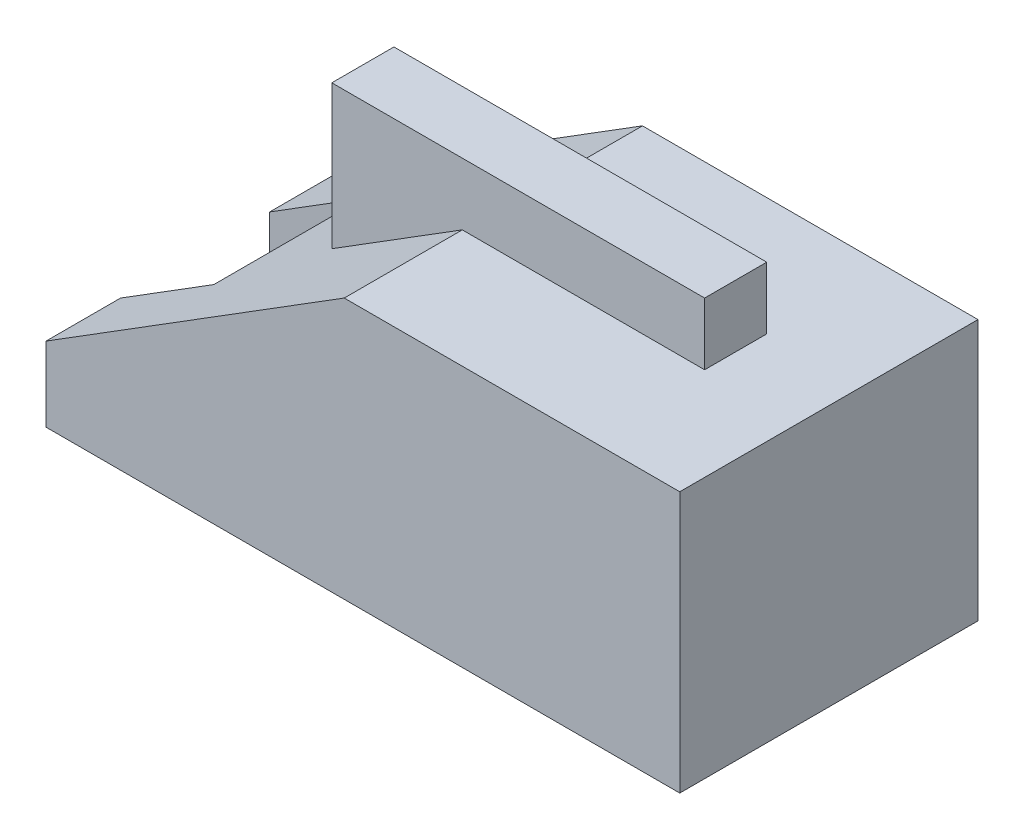
ISO-10303-21;
HEADER;
FILE_DESCRIPTION(('STEP AP214'),'2;1');
FILE_NAME('part.step','',(''),(''),'','','');
FILE_SCHEMA(('AUTOMOTIVE_DESIGN { 1 0 10303 214 1 1 1 1 }'));
ENDSEC;
DATA;
#1=APPLICATION_CONTEXT('core data for automotive mechanical design processes');
#2=APPLICATION_PROTOCOL_DEFINITION('international standard','automotive_design',2000,#1);
#3=PRODUCT_CONTEXT('',#1,'mechanical');
#4=PRODUCT('Part','Part','',(#3));
#5=PRODUCT_RELATED_PRODUCT_CATEGORY('part','',(#4));
#6=PRODUCT_DEFINITION_FORMATION('','',#4);
#7=PRODUCT_DEFINITION_CONTEXT('part definition',#1,'design');
#8=PRODUCT_DEFINITION('design','',#6,#7);
#9=PRODUCT_DEFINITION_SHAPE('','',#8);
#10=(LENGTH_UNIT() NAMED_UNIT(*) SI_UNIT(.MILLI.,.METRE.));
#11=(NAMED_UNIT(*) PLANE_ANGLE_UNIT() SI_UNIT($,.RADIAN.));
#12=(NAMED_UNIT(*) SI_UNIT($,.STERADIAN.) SOLID_ANGLE_UNIT());
#13=UNCERTAINTY_MEASURE_WITH_UNIT(LENGTH_MEASURE(1.E-05),#10,'distance_accuracy_value','');
#14=(GEOMETRIC_REPRESENTATION_CONTEXT(3) GLOBAL_UNCERTAINTY_ASSIGNED_CONTEXT((#13)) GLOBAL_UNIT_ASSIGNED_CONTEXT((#10,
#11,#12)) REPRESENTATION_CONTEXT('',''));
#15=CARTESIAN_POINT('',(0.,0.,0.));
#16=DIRECTION('',(0.,0.,1.));
#17=DIRECTION('',(1.,0.,0.));
#18=AXIS2_PLACEMENT_3D('',#15,#16,#17);
#19=CARTESIAN_POINT('',(48.,42.,24.));
#20=DIRECTION('',(0.52999894000318,-0.847998304005088,0.));
#21=DIRECTION('',(0.847998304005088,0.52999894000318,0.));
#22=AXIS2_PLACEMENT_3D('',#19,#20,#21);
#23=PLANE('',#22);
#24=DIRECTION('',(0.847998304005088,0.52999894000318,0.));
#25=VECTOR('',#24,1.);
#26=CARTESIAN_POINT('',(17.9779775280899,23.2362359550562,-12.));
#27=LINE('',#26,#25);
#28=CARTESIAN_POINT('',(0.,12.,-12.));
#29=VERTEX_POINT('',#28);
#30=CARTESIAN_POINT('',(15.,21.375,-12.));
#31=VERTEX_POINT('',#30);
#32=EDGE_CURVE('E135',#29,#31,#27,.T.);
#33=ORIENTED_EDGE('',*,*,#32,.T.);
#34=DIRECTION('',(0.,0.,1.));
#35=VECTOR('',#34,1.);
#36=CARTESIAN_POINT('',(15.,21.375,12.));
#37=LINE('',#36,#35);
#38=CARTESIAN_POINT('',(15.,21.375,12.));
#39=VERTEX_POINT('',#38);
#40=EDGE_CURVE('E145',#31,#39,#37,.T.);
#41=ORIENTED_EDGE('',*,*,#40,.T.);
#42=DIRECTION('',(-0.847998304005088,-0.52999894000318,0.));
#43=VECTOR('',#42,1.);
#44=CARTESIAN_POINT('',(17.9779775280899,23.2362359550562,12.));
#45=LINE('',#44,#43);
#46=CARTESIAN_POINT('',(0.,12.,12.));
#47=VERTEX_POINT('',#46);
#48=EDGE_CURVE('E257',#39,#47,#45,.T.);
#49=ORIENTED_EDGE('',*,*,#48,.T.);
#50=DIRECTION('',(0.,0.,-1.));
#51=VECTOR('',#50,1.);
#52=CARTESIAN_POINT('',(0.,12.,24.));
#53=LINE('',#52,#51);
#54=CARTESIAN_POINT('',(0.,12.,24.));
#55=VERTEX_POINT('',#54);
#56=EDGE_CURVE('E158',#55,#47,#53,.T.);
#57=ORIENTED_EDGE('',*,*,#56,.F.);
#58=DIRECTION('',(-0.847998304005088,-0.52999894000318,0.));
#59=VECTOR('',#58,1.);
#60=CARTESIAN_POINT('',(48.,42.,24.));
#61=LINE('',#60,#59);
#62=CARTESIAN_POINT('',(48.,42.,24.));
#63=VERTEX_POINT('',#62);
#64=EDGE_CURVE('E159',#63,#55,#61,.T.);
#65=ORIENTED_EDGE('',*,*,#64,.F.);
#66=DIRECTION('',(0.,0.,-1.));
#67=VECTOR('',#66,1.);
#68=CARTESIAN_POINT('',(48.,42.,24.));
#69=LINE('',#68,#67);
#70=CARTESIAN_POINT('',(48.,42.,5.));
#71=VERTEX_POINT('',#70);
#72=EDGE_CURVE('E168',#63,#71,#69,.T.);
#73=ORIENTED_EDGE('',*,*,#72,.T.);
#74=DIRECTION('',(0.847998304005088,0.52999894000318,0.));
#75=VECTOR('',#74,1.);
#76=CARTESIAN_POINT('',(48.,42.,5.));
#77=LINE('',#76,#75);
#78=CARTESIAN_POINT('',(27.,28.875,5.));
#79=VERTEX_POINT('',#78);
#80=EDGE_CURVE('E179',#79,#71,#77,.T.);
#81=ORIENTED_EDGE('',*,*,#80,.F.);
#82=DIRECTION('',(0.,0.,1.));
#83=VECTOR('',#82,1.);
#84=CARTESIAN_POINT('',(27.,28.875,24.));
#85=LINE('',#84,#83);
#86=CARTESIAN_POINT('',(27.,28.875,-5.));
#87=VERTEX_POINT('',#86);
#88=EDGE_CURVE('E182',#87,#79,#85,.T.);
#89=ORIENTED_EDGE('',*,*,#88,.F.);
#90=DIRECTION('',(-0.847998304005088,-0.52999894000318,0.));
#91=VECTOR('',#90,1.);
#92=CARTESIAN_POINT('',(48.,42.,-5.));
#93=LINE('',#92,#91);
#94=CARTESIAN_POINT('',(48.,42.,-5.));
#95=VERTEX_POINT('',#94);
#96=EDGE_CURVE('E41',#95,#87,#93,.T.);
#97=ORIENTED_EDGE('',*,*,#96,.F.);
#98=CARTESIAN_POINT('',(48.,42.,-24.));
#99=VERTEX_POINT('',#98);
#100=EDGE_CURVE('E162',#95,#99,#69,.T.);
#101=ORIENTED_EDGE('',*,*,#100,.T.);
#102=DIRECTION('',(-0.847998304005088,-0.52999894000318,0.));
#103=VECTOR('',#102,1.);
#104=CARTESIAN_POINT('',(48.,42.,-24.));
#105=LINE('',#104,#103);
#106=CARTESIAN_POINT('',(0.,12.,-24.));
#107=VERTEX_POINT('',#106);
#108=EDGE_CURVE('E156',#99,#107,#105,.T.);
#109=ORIENTED_EDGE('',*,*,#108,.T.);
#110=EDGE_CURVE('E150',#29,#107,#53,.T.);
#111=ORIENTED_EDGE('',*,*,#110,.F.);
#112=EDGE_LOOP('',(#33,#41,#49,#57,#65,#73,#81,#89,#97,#101,#109,#111));
#113=FACE_BOUND('',#112,.T.);
#114=ADVANCED_FACE('F33',(#113),#23,.F.);
#115=CARTESIAN_POINT('',(0.,12.,24.));
#116=DIRECTION('',(1.,0.,0.));
#117=DIRECTION('',(0.,1.,0.));
#118=AXIS2_PLACEMENT_3D('',#115,#116,#117);
#119=PLANE('',#118);
#120=DIRECTION('',(0.,-1.,0.));
#121=VECTOR('',#120,1.);
#122=CARTESIAN_POINT('',(0.,52.001,-12.));
#123=LINE('',#122,#121);
#124=CARTESIAN_POINT('',(0.,0.,-12.));
#125=VERTEX_POINT('',#124);
#126=EDGE_CURVE('E139',#29,#125,#123,.T.);
#127=ORIENTED_EDGE('',*,*,#126,.F.);
#128=ORIENTED_EDGE('',*,*,#110,.T.);
#129=DIRECTION('',(0.,-1.,0.));
#130=VECTOR('',#129,1.);
#131=CARTESIAN_POINT('',(0.,12.,-24.));
#132=LINE('',#131,#130);
#133=CARTESIAN_POINT('',(0.,0.,-24.));
#134=VERTEX_POINT('',#133);
#135=EDGE_CURVE('E209',#107,#134,#132,.T.);
#136=ORIENTED_EDGE('',*,*,#135,.T.);
#137=DIRECTION('',(0.,0.,-1.));
#138=VECTOR('',#137,1.);
#139=CARTESIAN_POINT('',(0.,0.,24.));
#140=LINE('',#139,#138);
#141=EDGE_CURVE('E152',#125,#134,#140,.T.);
#142=ORIENTED_EDGE('',*,*,#141,.F.);
#143=EDGE_LOOP('',(#127,#128,#136,#142));
#144=FACE_BOUND('',#143,.T.);
#145=ADVANCED_FACE('F35',(#144),#119,.F.);
#146=DIRECTION('',(0.,-1.,0.));
#147=VECTOR('',#146,1.);
#148=CARTESIAN_POINT('',(0.,52.001,12.));
#149=LINE('',#148,#147);
#150=CARTESIAN_POINT('',(0.,0.,12.));
#151=VERTEX_POINT('',#150);
#152=EDGE_CURVE('E153',#47,#151,#149,.T.);
#153=ORIENTED_EDGE('',*,*,#152,.T.);
#154=CARTESIAN_POINT('',(0.,0.,24.));
#155=VERTEX_POINT('',#154);
#156=EDGE_CURVE('E176',#155,#151,#140,.T.);
#157=ORIENTED_EDGE('',*,*,#156,.F.);
#158=DIRECTION('',(0.,-1.,0.));
#159=VECTOR('',#158,1.);
#160=CARTESIAN_POINT('',(0.,12.,24.));
#161=LINE('',#160,#159);
#162=EDGE_CURVE('E210',#55,#155,#161,.T.);
#163=ORIENTED_EDGE('',*,*,#162,.F.);
#164=ORIENTED_EDGE('',*,*,#56,.T.);
#165=EDGE_LOOP('',(#153,#157,#163,#164));
#166=FACE_BOUND('',#165,.T.);
#167=ADVANCED_FACE('F247',(#166),#119,.F.);
#168=CARTESIAN_POINT('',(0.,0.,24.));
#169=DIRECTION('',(0.,1.,0.));
#170=DIRECTION('',(0.,0.,1.));
#171=AXIS2_PLACEMENT_3D('',#168,#169,#170);
#172=PLANE('',#171);
#173=DIRECTION('',(-1.,0.,0.));
#174=VECTOR('',#173,1.);
#175=CARTESIAN_POINT('',(0.,0.,-12.));
#176=LINE('',#175,#174);
#177=CARTESIAN_POINT('',(15.,0.,-12.));
#178=VERTEX_POINT('',#177);
#179=EDGE_CURVE('E282',#178,#125,#176,.T.);
#180=ORIENTED_EDGE('',*,*,#179,.T.);
#181=ORIENTED_EDGE('',*,*,#141,.T.);
#182=DIRECTION('',(1.,0.,0.));
#183=VECTOR('',#182,1.);
#184=CARTESIAN_POINT('',(0.,0.,-24.));
#185=LINE('',#184,#183);
#186=CARTESIAN_POINT('',(102.,0.,-24.));
#187=VERTEX_POINT('',#186);
#188=EDGE_CURVE('E219',#134,#187,#185,.T.);
#189=ORIENTED_EDGE('',*,*,#188,.T.);
#190=DIRECTION('',(0.,0.,-1.));
#191=VECTOR('',#190,1.);
#192=CARTESIAN_POINT('',(102.,0.,24.));
#193=LINE('',#192,#191);
#194=CARTESIAN_POINT('',(102.,0.,24.));
#195=VERTEX_POINT('',#194);
#196=EDGE_CURVE('E173',#195,#187,#193,.T.);
#197=ORIENTED_EDGE('',*,*,#196,.F.);
#198=DIRECTION('',(1.,0.,0.));
#199=VECTOR('',#198,1.);
#200=CARTESIAN_POINT('',(0.,0.,24.));
#201=LINE('',#200,#199);
#202=EDGE_CURVE('E213',#155,#195,#201,.T.);
#203=ORIENTED_EDGE('',*,*,#202,.F.);
#204=ORIENTED_EDGE('',*,*,#156,.T.);
#205=DIRECTION('',(1.,0.,0.));
#206=VECTOR('',#205,1.);
#207=CARTESIAN_POINT('',(0.,0.,12.));
#208=LINE('',#207,#206);
#209=CARTESIAN_POINT('',(15.,0.,12.));
#210=VERTEX_POINT('',#209);
#211=EDGE_CURVE('E244',#151,#210,#208,.T.);
#212=ORIENTED_EDGE('',*,*,#211,.T.);
#213=DIRECTION('',(0.,0.,-1.));
#214=VECTOR('',#213,1.);
#215=CARTESIAN_POINT('',(15.,0.,12.));
#216=LINE('',#215,#214);
#217=EDGE_CURVE('E48',#210,#178,#216,.T.);
#218=ORIENTED_EDGE('',*,*,#217,.T.);
#219=EDGE_LOOP('',(#180,#181,#189,#197,#203,#204,#212,#218));
#220=FACE_BOUND('',#219,.T.);
#221=ADVANCED_FACE('F234',(#220),#172,.F.);
#222=CARTESIAN_POINT('',(102.,42.,24.));
#223=DIRECTION('',(0.,-1.,0.));
#224=DIRECTION('',(1.,0.,0.));
#225=AXIS2_PLACEMENT_3D('',#222,#223,#224);
#226=PLANE('',#225);
#227=DIRECTION('',(-1.,0.,0.));
#228=VECTOR('',#227,1.);
#229=CARTESIAN_POINT('',(102.,42.,-5.));
#230=LINE('',#229,#228);
#231=CARTESIAN_POINT('',(87.,42.,-5.));
#232=VERTEX_POINT('',#231);
#233=EDGE_CURVE('E56',#232,#95,#230,.T.);
#234=ORIENTED_EDGE('',*,*,#233,.F.);
#235=DIRECTION('',(0.,0.,-1.));
#236=VECTOR('',#235,1.);
#237=CARTESIAN_POINT('',(87.,42.,24.));
#238=LINE('',#237,#236);
#239=CARTESIAN_POINT('',(87.,42.,5.));
#240=VERTEX_POINT('',#239);
#241=EDGE_CURVE('E11',#240,#232,#238,.T.);
#242=ORIENTED_EDGE('',*,*,#241,.F.);
#243=DIRECTION('',(1.,0.,0.));
#244=VECTOR('',#243,1.);
#245=CARTESIAN_POINT('',(102.,42.,5.));
#246=LINE('',#245,#244);
#247=EDGE_CURVE('E200',#71,#240,#246,.T.);
#248=ORIENTED_EDGE('',*,*,#247,.F.);
#249=ORIENTED_EDGE('',*,*,#72,.F.);
#250=DIRECTION('',(-1.,0.,0.));
#251=VECTOR('',#250,1.);
#252=CARTESIAN_POINT('',(102.,42.,24.));
#253=LINE('',#252,#251);
#254=CARTESIAN_POINT('',(102.,42.,24.));
#255=VERTEX_POINT('',#254);
#256=EDGE_CURVE('E163',#255,#63,#253,.T.);
#257=ORIENTED_EDGE('',*,*,#256,.F.);
#258=DIRECTION('',(0.,0.,-1.));
#259=VECTOR('',#258,1.);
#260=CARTESIAN_POINT('',(102.,42.,24.));
#261=LINE('',#260,#259);
#262=CARTESIAN_POINT('',(102.,42.,-24.));
#263=VERTEX_POINT('',#262);
#264=EDGE_CURVE('E170',#255,#263,#261,.T.);
#265=ORIENTED_EDGE('',*,*,#264,.T.);
#266=DIRECTION('',(-1.,0.,0.));
#267=VECTOR('',#266,1.);
#268=CARTESIAN_POINT('',(102.,42.,-24.));
#269=LINE('',#268,#267);
#270=EDGE_CURVE('E222',#263,#99,#269,.T.);
#271=ORIENTED_EDGE('',*,*,#270,.T.);
#272=ORIENTED_EDGE('',*,*,#100,.F.);
#273=EDGE_LOOP('',(#234,#242,#248,#249,#257,#265,#271,#272));
#274=FACE_BOUND('',#273,.T.);
#275=ADVANCED_FACE('F225',(#274),#226,.F.);
#276=CARTESIAN_POINT('',(102.,0.,24.));
#277=DIRECTION('',(-1.,0.,0.));
#278=DIRECTION('',(0.,0.,1.));
#279=AXIS2_PLACEMENT_3D('',#276,#277,#278);
#280=PLANE('',#279);
#281=DIRECTION('',(0.,1.,0.));
#282=VECTOR('',#281,1.);
#283=CARTESIAN_POINT('',(102.,0.,-24.));
#284=LINE('',#283,#282);
#285=EDGE_CURVE('E221',#187,#263,#284,.T.);
#286=ORIENTED_EDGE('',*,*,#285,.T.);
#287=ORIENTED_EDGE('',*,*,#264,.F.);
#288=DIRECTION('',(0.,1.,0.));
#289=VECTOR('',#288,1.);
#290=CARTESIAN_POINT('',(102.,0.,24.));
#291=LINE('',#290,#289);
#292=EDGE_CURVE('E215',#195,#255,#291,.T.);
#293=ORIENTED_EDGE('',*,*,#292,.F.);
#294=ORIENTED_EDGE('',*,*,#196,.T.);
#295=EDGE_LOOP('',(#286,#287,#293,#294));
#296=FACE_BOUND('',#295,.T.);
#297=ADVANCED_FACE('F237',(#296),#280,.F.);
#298=CARTESIAN_POINT('',(0.,0.,24.));
#299=DIRECTION('',(0.,0.,1.));
#300=DIRECTION('',(1.,0.,0.));
#301=AXIS2_PLACEMENT_3D('',#298,#299,#300);
#302=PLANE('',#301);
#303=ORIENTED_EDGE('',*,*,#162,.T.);
#304=ORIENTED_EDGE('',*,*,#202,.T.);
#305=ORIENTED_EDGE('',*,*,#292,.T.);
#306=ORIENTED_EDGE('',*,*,#256,.T.);
#307=ORIENTED_EDGE('',*,*,#64,.T.);
#308=EDGE_LOOP('',(#303,#304,#305,#306,#307));
#309=FACE_BOUND('',#308,.T.);
#310=ADVANCED_FACE('F239',(#309),#302,.T.);
#311=CARTESIAN_POINT('',(0.,0.,-24.));
#312=DIRECTION('',(0.,0.,1.));
#313=DIRECTION('',(1.,0.,0.));
#314=AXIS2_PLACEMENT_3D('',#311,#312,#313);
#315=PLANE('',#314);
#316=ORIENTED_EDGE('',*,*,#135,.F.);
#317=ORIENTED_EDGE('',*,*,#108,.F.);
#318=ORIENTED_EDGE('',*,*,#270,.F.);
#319=ORIENTED_EDGE('',*,*,#285,.F.);
#320=ORIENTED_EDGE('',*,*,#188,.F.);
#321=EDGE_LOOP('',(#316,#317,#318,#319,#320));
#322=FACE_BOUND('',#321,.T.);
#323=ADVANCED_FACE('F230',(#322),#315,.F.);
#324=CARTESIAN_POINT('',(87.,52.,5.));
#325=DIRECTION('',(-1.,0.,0.));
#326=DIRECTION('',(0.,0.,1.));
#327=AXIS2_PLACEMENT_3D('',#324,#325,#326);
#328=PLANE('',#327);
#329=DIRECTION('',(0.,-1.,0.));
#330=VECTOR('',#329,1.);
#331=CARTESIAN_POINT('',(87.,52.,5.));
#332=LINE('',#331,#330);
#333=CARTESIAN_POINT('',(87.,52.,5.));
#334=VERTEX_POINT('',#333);
#335=EDGE_CURVE('E202',#334,#240,#332,.T.);
#336=ORIENTED_EDGE('',*,*,#335,.T.);
#337=ORIENTED_EDGE('',*,*,#241,.T.);
#338=DIRECTION('',(0.,-1.,0.));
#339=VECTOR('',#338,1.);
#340=CARTESIAN_POINT('',(87.,52.,-5.));
#341=LINE('',#340,#339);
#342=CARTESIAN_POINT('',(87.,52.,-5.));
#343=VERTEX_POINT('',#342);
#344=EDGE_CURVE('E197',#343,#232,#341,.T.);
#345=ORIENTED_EDGE('',*,*,#344,.F.);
#346=DIRECTION('',(0.,0.,-1.));
#347=VECTOR('',#346,1.);
#348=CARTESIAN_POINT('',(87.,52.,5.));
#349=LINE('',#348,#347);
#350=EDGE_CURVE('E259',#334,#343,#349,.T.);
#351=ORIENTED_EDGE('',*,*,#350,.F.);
#352=EDGE_LOOP('',(#336,#337,#345,#351));
#353=FACE_BOUND('',#352,.T.);
#354=ADVANCED_FACE('F270',(#353),#328,.F.);
#355=CARTESIAN_POINT('',(27.,52.,-5.));
#356=DIRECTION('',(0.,0.,1.));
#357=DIRECTION('',(1.,0.,0.));
#358=AXIS2_PLACEMENT_3D('',#355,#356,#357);
#359=PLANE('',#358);
#360=ORIENTED_EDGE('',*,*,#344,.T.);
#361=ORIENTED_EDGE('',*,*,#233,.T.);
#362=ORIENTED_EDGE('',*,*,#96,.T.);
#363=DIRECTION('',(0.,-1.,0.));
#364=VECTOR('',#363,1.);
#365=CARTESIAN_POINT('',(27.,52.,-5.));
#366=LINE('',#365,#364);
#367=CARTESIAN_POINT('',(27.,52.,-5.));
#368=VERTEX_POINT('',#367);
#369=EDGE_CURVE('E190',#368,#87,#366,.T.);
#370=ORIENTED_EDGE('',*,*,#369,.F.);
#371=DIRECTION('',(-1.,0.,0.));
#372=VECTOR('',#371,1.);
#373=CARTESIAN_POINT('',(27.,52.,-5.));
#374=LINE('',#373,#372);
#375=EDGE_CURVE('E262',#343,#368,#374,.T.);
#376=ORIENTED_EDGE('',*,*,#375,.F.);
#377=EDGE_LOOP('',(#360,#361,#362,#370,#376));
#378=FACE_BOUND('',#377,.T.);
#379=ADVANCED_FACE('F189',(#378),#359,.F.);
#380=CARTESIAN_POINT('',(27.,52.,5.));
#381=DIRECTION('',(1.,0.,0.));
#382=DIRECTION('',(0.,0.,-1.));
#383=AXIS2_PLACEMENT_3D('',#380,#381,#382);
#384=PLANE('',#383);
#385=ORIENTED_EDGE('',*,*,#369,.T.);
#386=ORIENTED_EDGE('',*,*,#88,.T.);
#387=DIRECTION('',(0.,-1.,0.));
#388=VECTOR('',#387,1.);
#389=CARTESIAN_POINT('',(27.,52.,5.));
#390=LINE('',#389,#388);
#391=CARTESIAN_POINT('',(27.,52.,5.));
#392=VERTEX_POINT('',#391);
#393=EDGE_CURVE('E198',#392,#79,#390,.T.);
#394=ORIENTED_EDGE('',*,*,#393,.F.);
#395=DIRECTION('',(0.,0.,1.));
#396=VECTOR('',#395,1.);
#397=CARTESIAN_POINT('',(27.,52.,5.));
#398=LINE('',#397,#396);
#399=EDGE_CURVE('E196',#368,#392,#398,.T.);
#400=ORIENTED_EDGE('',*,*,#399,.F.);
#401=EDGE_LOOP('',(#385,#386,#394,#400));
#402=FACE_BOUND('',#401,.T.);
#403=ADVANCED_FACE('F193',(#402),#384,.F.);
#404=CARTESIAN_POINT('',(27.,52.,5.));
#405=DIRECTION('',(0.,0.,-1.));
#406=DIRECTION('',(-1.,0.,0.));
#407=AXIS2_PLACEMENT_3D('',#404,#405,#406);
#408=PLANE('',#407);
#409=ORIENTED_EDGE('',*,*,#80,.T.);
#410=ORIENTED_EDGE('',*,*,#247,.T.);
#411=ORIENTED_EDGE('',*,*,#335,.F.);
#412=DIRECTION('',(1.,0.,0.));
#413=VECTOR('',#412,1.);
#414=CARTESIAN_POINT('',(27.,52.,5.));
#415=LINE('',#414,#413);
#416=EDGE_CURVE('E265',#392,#334,#415,.T.);
#417=ORIENTED_EDGE('',*,*,#416,.F.);
#418=ORIENTED_EDGE('',*,*,#393,.T.);
#419=EDGE_LOOP('',(#409,#410,#411,#417,#418));
#420=FACE_BOUND('',#419,.T.);
#421=ADVANCED_FACE('F274',(#420),#408,.F.);
#422=CARTESIAN_POINT('',(0.,52.,0.));
#423=DIRECTION('',(0.,-1.,0.));
#424=DIRECTION('',(0.,0.,-1.));
#425=AXIS2_PLACEMENT_3D('',#422,#423,#424);
#426=PLANE('',#425);
#427=ORIENTED_EDGE('',*,*,#350,.T.);
#428=ORIENTED_EDGE('',*,*,#375,.T.);
#429=ORIENTED_EDGE('',*,*,#399,.T.);
#430=ORIENTED_EDGE('',*,*,#416,.T.);
#431=EDGE_LOOP('',(#427,#428,#429,#430));
#432=FACE_BOUND('',#431,.T.);
#433=ADVANCED_FACE('F284',(#432),#426,.F.);
#434=CARTESIAN_POINT('',(15.,52.001,12.));
#435=DIRECTION('',(-1.,0.,0.));
#436=DIRECTION('',(0.,0.,1.));
#437=AXIS2_PLACEMENT_3D('',#434,#435,#436);
#438=PLANE('',#437);
#439=DIRECTION('',(0.,-1.,0.));
#440=VECTOR('',#439,1.);
#441=CARTESIAN_POINT('',(15.,52.001,-12.));
#442=LINE('',#441,#440);
#443=EDGE_CURVE('E141',#31,#178,#442,.T.);
#444=ORIENTED_EDGE('',*,*,#443,.T.);
#445=ORIENTED_EDGE('',*,*,#217,.F.);
#446=DIRECTION('',(0.,-1.,0.));
#447=VECTOR('',#446,1.);
#448=CARTESIAN_POINT('',(15.,52.001,12.));
#449=LINE('',#448,#447);
#450=EDGE_CURVE('E251',#39,#210,#449,.T.);
#451=ORIENTED_EDGE('',*,*,#450,.F.);
#452=ORIENTED_EDGE('',*,*,#40,.F.);
#453=EDGE_LOOP('',(#444,#445,#451,#452));
#454=FACE_BOUND('',#453,.T.);
#455=ADVANCED_FACE('F278',(#454),#438,.T.);
#456=CARTESIAN_POINT('',(0.,52.001,-12.));
#457=DIRECTION('',(0.,0.,1.));
#458=DIRECTION('',(1.,0.,0.));
#459=AXIS2_PLACEMENT_3D('',#456,#457,#458);
#460=PLANE('',#459);
#461=ORIENTED_EDGE('',*,*,#126,.T.);
#462=ORIENTED_EDGE('',*,*,#179,.F.);
#463=ORIENTED_EDGE('',*,*,#443,.F.);
#464=ORIENTED_EDGE('',*,*,#32,.F.);
#465=EDGE_LOOP('',(#461,#462,#463,#464));
#466=FACE_BOUND('',#465,.T.);
#467=ADVANCED_FACE('F137',(#466),#460,.T.);
#468=CARTESIAN_POINT('',(0.,52.001,12.));
#469=DIRECTION('',(0.,0.,-1.));
#470=DIRECTION('',(-1.,0.,0.));
#471=AXIS2_PLACEMENT_3D('',#468,#469,#470);
#472=PLANE('',#471);
#473=ORIENTED_EDGE('',*,*,#450,.T.);
#474=ORIENTED_EDGE('',*,*,#211,.F.);
#475=ORIENTED_EDGE('',*,*,#152,.F.);
#476=ORIENTED_EDGE('',*,*,#48,.F.);
#477=EDGE_LOOP('',(#473,#474,#475,#476));
#478=FACE_BOUND('',#477,.T.);
#479=ADVANCED_FACE('F277',(#478),#472,.T.);
#480=CLOSED_SHELL('',(#114,#145,#167,#221,#275,#297,#310,#323,#354,#379,#403,#421,#433,#455,
#467,#479));
#481=MANIFOLD_SOLID_BREP('B2',#480);
#482=ADVANCED_BREP_SHAPE_REPRESENTATION('',(#18,#481),#14);
#483=SHAPE_DEFINITION_REPRESENTATION(#9,#482);
ENDSEC;
END-ISO-10303-21;
